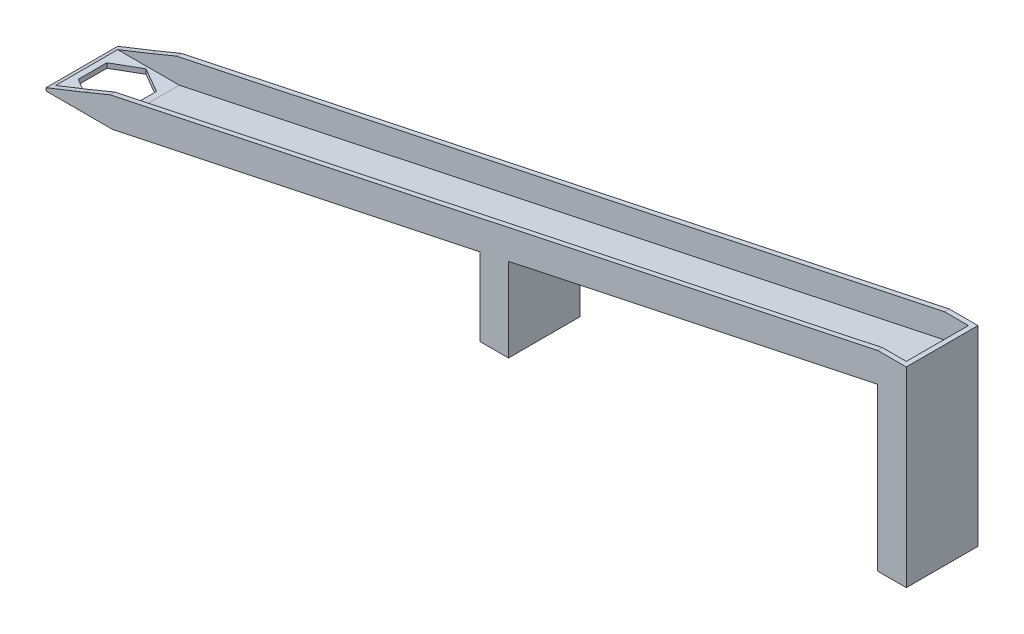
ISO-10303-21;
HEADER;
FILE_DESCRIPTION(('STEP AP214'),'2;1');
FILE_NAME('part.step','',(''),(''),'','','');
FILE_SCHEMA(('AUTOMOTIVE_DESIGN { 1 0 10303 214 1 1 1 1 }'));
ENDSEC;
DATA;
#1=APPLICATION_CONTEXT('core data for automotive mechanical design processes');
#2=APPLICATION_PROTOCOL_DEFINITION('international standard','automotive_design',2000,#1);
#3=PRODUCT_CONTEXT('',#1,'mechanical');
#4=PRODUCT('Part','Part','',(#3));
#5=PRODUCT_RELATED_PRODUCT_CATEGORY('part','',(#4));
#6=PRODUCT_DEFINITION_FORMATION('','',#4);
#7=PRODUCT_DEFINITION_CONTEXT('part definition',#1,'design');
#8=PRODUCT_DEFINITION('design','',#6,#7);
#9=PRODUCT_DEFINITION_SHAPE('','',#8);
#10=(LENGTH_UNIT() NAMED_UNIT(*) SI_UNIT(.MILLI.,.METRE.));
#11=(NAMED_UNIT(*) PLANE_ANGLE_UNIT() SI_UNIT($,.RADIAN.));
#12=(NAMED_UNIT(*) SI_UNIT($,.STERADIAN.) SOLID_ANGLE_UNIT());
#13=UNCERTAINTY_MEASURE_WITH_UNIT(LENGTH_MEASURE(1.E-05),#10,'distance_accuracy_value','');
#14=(GEOMETRIC_REPRESENTATION_CONTEXT(3) GLOBAL_UNCERTAINTY_ASSIGNED_CONTEXT((#13)) GLOBAL_UNIT_ASSIGNED_CONTEXT((#10,
#11,#12)) REPRESENTATION_CONTEXT('',''));
#15=CARTESIAN_POINT('',(0.,0.,0.));
#16=DIRECTION('',(0.,0.,1.));
#17=DIRECTION('',(1.,0.,0.));
#18=AXIS2_PLACEMENT_3D('',#15,#16,#17);
#19=CARTESIAN_POINT('',(70.,0.,75.));
#20=DIRECTION('',(-0.207080952730413,0.978323810921652,0.));
#21=DIRECTION('',(-0.978323810921652,-0.207080952730413,0.));
#22=AXIS2_PLACEMENT_3D('',#19,#20,#21);
#23=PLANE('',#22);
#24=DIRECTION('',(0.978323810921652,0.207080952730413,0.));
#25=VECTOR('',#24,1.);
#26=CARTESIAN_POINT('',(70.,0.,75.));
#27=LINE('',#26,#25);
#28=CARTESIAN_POINT('',(483.833635791434,87.5958068431843,75.));
#29=VERTEX_POINT('',#28);
#30=CARTESIAN_POINT('',(870.,169.335306301359,75.));
#31=VERTEX_POINT('',#30);
#32=EDGE_CURVE('E52',#29,#31,#27,.T.);
#33=ORIENTED_EDGE('',*,*,#32,.F.);
#34=DIRECTION('',(0.,0.,1.));
#35=VECTOR('',#34,1.);
#36=CARTESIAN_POINT('',(483.833635791434,87.5958068431843,0.));
#37=LINE('',#36,#35);
#38=CARTESIAN_POINT('',(483.833635791434,87.5958068431843,0.));
#39=VERTEX_POINT('',#38);
#40=EDGE_CURVE('E255',#39,#29,#37,.T.);
#41=ORIENTED_EDGE('',*,*,#40,.F.);
#42=DIRECTION('',(0.978323810921652,0.207080952730413,0.));
#43=VECTOR('',#42,1.);
#44=CARTESIAN_POINT('',(70.,0.,0.));
#45=LINE('',#44,#43);
#46=CARTESIAN_POINT('',(870.,169.335306301359,0.));
#47=VERTEX_POINT('',#46);
#48=EDGE_CURVE('E387',#39,#47,#45,.T.);
#49=ORIENTED_EDGE('',*,*,#48,.T.);
#50=DIRECTION('',(0.,0.,-1.));
#51=VECTOR('',#50,1.);
#52=CARTESIAN_POINT('',(870.,169.335306301359,75.));
#53=LINE('',#52,#51);
#54=EDGE_CURVE('E406',#31,#47,#53,.T.);
#55=ORIENTED_EDGE('',*,*,#54,.F.);
#56=EDGE_LOOP('',(#33,#41,#49,#55));
#57=FACE_BOUND('',#56,.T.);
#58=ADVANCED_FACE('F37',(#57),#23,.F.);
#59=CARTESIAN_POINT('',(900.,200.,75.));
#60=DIRECTION('',(0.,-1.,0.));
#61=DIRECTION('',(1.,0.,0.));
#62=AXIS2_PLACEMENT_3D('',#59,#60,#61);
#63=PLANE('',#62);
#64=DIRECTION('',(-1.,0.,0.));
#65=VECTOR('',#64,1.);
#66=CARTESIAN_POINT('',(900.,200.,5.));
#67=LINE('',#66,#65);
#68=CARTESIAN_POINT('',(895.,200.,5.));
#69=VERTEX_POINT('',#68);
#70=CARTESIAN_POINT('',(870.,200.,5.));
#71=VERTEX_POINT('',#70);
#72=EDGE_CURVE('E356',#69,#71,#67,.T.);
#73=ORIENTED_EDGE('',*,*,#72,.F.);
#74=DIRECTION('',(0.,0.,-1.));
#75=VECTOR('',#74,1.);
#76=CARTESIAN_POINT('',(895.,200.,75.));
#77=LINE('',#76,#75);
#78=CARTESIAN_POINT('',(895.,200.,70.));
#79=VERTEX_POINT('',#78);
#80=EDGE_CURVE('E352',#79,#69,#77,.T.);
#81=ORIENTED_EDGE('',*,*,#80,.F.);
#82=DIRECTION('',(-1.,0.,0.));
#83=VECTOR('',#82,1.);
#84=CARTESIAN_POINT('',(900.,200.,70.));
#85=LINE('',#84,#83);
#86=CARTESIAN_POINT('',(870.,200.,70.));
#87=VERTEX_POINT('',#86);
#88=EDGE_CURVE('E358',#79,#87,#85,.T.);
#89=ORIENTED_EDGE('',*,*,#88,.T.);
#90=DIRECTION('',(0.,0.,-1.));
#91=VECTOR('',#90,1.);
#92=CARTESIAN_POINT('',(870.,200.,75.));
#93=LINE('',#92,#91);
#94=CARTESIAN_POINT('',(870.,200.,75.));
#95=VERTEX_POINT('',#94);
#96=EDGE_CURVE('E400',#95,#87,#93,.T.);
#97=ORIENTED_EDGE('',*,*,#96,.F.);
#98=DIRECTION('',(-1.,0.,0.));
#99=VECTOR('',#98,1.);
#100=CARTESIAN_POINT('',(900.,200.,75.));
#101=LINE('',#100,#99);
#102=CARTESIAN_POINT('',(900.,200.,75.));
#103=VERTEX_POINT('',#102);
#104=EDGE_CURVE('E378',#103,#95,#101,.T.);
#105=ORIENTED_EDGE('',*,*,#104,.F.);
#106=DIRECTION('',(0.,0.,-1.));
#107=VECTOR('',#106,1.);
#108=CARTESIAN_POINT('',(900.,200.,75.));
#109=LINE('',#108,#107);
#110=CARTESIAN_POINT('',(900.,200.,0.));
#111=VERTEX_POINT('',#110);
#112=EDGE_CURVE('E403',#103,#111,#109,.T.);
#113=ORIENTED_EDGE('',*,*,#112,.T.);
#114=DIRECTION('',(-1.,0.,0.));
#115=VECTOR('',#114,1.);
#116=CARTESIAN_POINT('',(900.,200.,0.));
#117=LINE('',#116,#115);
#118=CARTESIAN_POINT('',(870.,200.,0.));
#119=VERTEX_POINT('',#118);
#120=EDGE_CURVE('E392',#111,#119,#117,.T.);
#121=ORIENTED_EDGE('',*,*,#120,.T.);
#122=EDGE_CURVE('E399',#71,#119,#93,.T.);
#123=ORIENTED_EDGE('',*,*,#122,.F.);
#124=EDGE_LOOP('',(#73,#81,#89,#97,#105,#113,#121,#123));
#125=FACE_BOUND('',#124,.T.);
#126=ADVANCED_FACE('F485',(#125),#63,.F.);
#127=CARTESIAN_POINT('',(870.,200.,75.));
#128=DIRECTION('',(0.207080952730413,-0.978323810921652,0.));
#129=DIRECTION('',(0.978323810921652,0.207080952730413,0.));
#130=AXIS2_PLACEMENT_3D('',#127,#128,#129);
#131=PLANE('',#130);
#132=DIRECTION('',(-0.978323810921652,-0.207080952730413,0.));
#133=VECTOR('',#132,1.);
#134=CARTESIAN_POINT('',(870.,200.,5.));
#135=LINE('',#134,#133);
#136=CARTESIAN_POINT('',(66.8597513978174,30.,5.));
#137=VERTEX_POINT('',#136);
#138=EDGE_CURVE('E340',#71,#137,#135,.T.);
#139=ORIENTED_EDGE('',*,*,#138,.F.);
#140=ORIENTED_EDGE('',*,*,#122,.T.);
#141=DIRECTION('',(-0.978323810921652,-0.207080952730413,0.));
#142=VECTOR('',#141,1.);
#143=CARTESIAN_POINT('',(870.,200.,0.));
#144=LINE('',#143,#142);
#145=CARTESIAN_POINT('',(66.8597513978174,30.,0.));
#146=VERTEX_POINT('',#145);
#147=EDGE_CURVE('E372',#119,#146,#144,.T.);
#148=ORIENTED_EDGE('',*,*,#147,.T.);
#149=DIRECTION('',(0.,0.,-1.));
#150=VECTOR('',#149,1.);
#151=CARTESIAN_POINT('',(66.8597513978174,30.,75.));
#152=LINE('',#151,#150);
#153=EDGE_CURVE('E383',#137,#146,#152,.T.);
#154=ORIENTED_EDGE('',*,*,#153,.F.);
#155=EDGE_LOOP('',(#139,#140,#148,#154));
#156=FACE_BOUND('',#155,.T.);
#157=ADVANCED_FACE('F449',(#156),#131,.F.);
#158=CARTESIAN_POINT('',(0.,30.,75.));
#159=DIRECTION('',(1.,0.,0.));
#160=DIRECTION('',(0.,1.,0.));
#161=AXIS2_PLACEMENT_3D('',#158,#159,#160);
#162=PLANE('',#161);
#163=DIRECTION('',(0.,-1.,0.));
#164=VECTOR('',#163,1.);
#165=CARTESIAN_POINT('',(0.,30.,75.));
#166=LINE('',#165,#164);
#167=CARTESIAN_POINT('',(0.,2.99999999999999,75.));
#168=VERTEX_POINT('',#167);
#169=CARTESIAN_POINT('',(0.,0.,75.));
#170=VERTEX_POINT('',#169);
#171=EDGE_CURVE('E369',#168,#170,#166,.T.);
#172=ORIENTED_EDGE('',*,*,#171,.F.);
#173=DIRECTION('',(0.,0.,1.));
#174=VECTOR('',#173,1.);
#175=CARTESIAN_POINT('',(0.,2.99999999999999,-15.));
#176=LINE('',#175,#174);
#177=CARTESIAN_POINT('',(0.,2.99999999999999,0.));
#178=VERTEX_POINT('',#177);
#179=EDGE_CURVE('E281',#178,#168,#176,.T.);
#180=ORIENTED_EDGE('',*,*,#179,.F.);
#181=DIRECTION('',(0.,-1.,0.));
#182=VECTOR('',#181,1.);
#183=CARTESIAN_POINT('',(0.,30.,0.));
#184=LINE('',#183,#182);
#185=CARTESIAN_POINT('',(0.,0.,0.));
#186=VERTEX_POINT('',#185);
#187=EDGE_CURVE('E335',#178,#186,#184,.T.);
#188=ORIENTED_EDGE('',*,*,#187,.T.);
#189=DIRECTION('',(0.,0.,-1.));
#190=VECTOR('',#189,1.);
#191=CARTESIAN_POINT('',(0.,0.,75.));
#192=LINE('',#191,#190);
#193=EDGE_CURVE('E412',#170,#186,#192,.T.);
#194=ORIENTED_EDGE('',*,*,#193,.F.);
#195=EDGE_LOOP('',(#172,#180,#188,#194));
#196=FACE_BOUND('',#195,.T.);
#197=ADVANCED_FACE('F39',(#196),#162,.F.);
#198=CARTESIAN_POINT('',(0.,0.,75.));
#199=DIRECTION('',(0.,1.,0.));
#200=DIRECTION('',(0.,0.,1.));
#201=AXIS2_PLACEMENT_3D('',#198,#199,#200);
#202=PLANE('',#201);
#203=DIRECTION('',(0.,0.,-1.));
#204=VECTOR('',#203,1.);
#205=CARTESIAN_POINT('',(63.1909474220098,0.,75.));
#206=LINE('',#205,#204);
#207=CARTESIAN_POINT('',(63.1909474220098,0.,52.5818310934814));
#208=VERTEX_POINT('',#207);
#209=CARTESIAN_POINT('',(63.1909474220098,0.,22.5818310934814));
#210=VERTEX_POINT('',#209);
#211=EDGE_CURVE('E427',#208,#210,#206,.T.);
#212=ORIENTED_EDGE('',*,*,#211,.T.);
#213=DIRECTION('',(-0.866025403784439,0.,-0.5));
#214=VECTOR('',#213,1.);
#215=CARTESIAN_POINT('',(38.4954698019568,0.,8.32389044177741));
#216=LINE('',#215,#214);
#217=CARTESIAN_POINT('',(37.2101853084766,0.,7.58183109348139));
#218=VERTEX_POINT('',#217);
#219=EDGE_CURVE('E430',#210,#218,#216,.T.);
#220=ORIENTED_EDGE('',*,*,#219,.T.);
#221=DIRECTION('',(-0.866025403784439,0.,0.5));
#222=VECTOR('',#221,1.);
#223=CARTESIAN_POINT('',(-19.8903771477185,0.,40.5488561984447));
#224=LINE('',#223,#222);
#225=CARTESIAN_POINT('',(11.2294231949435,0.,22.5818310934814));
#226=VERTEX_POINT('',#225);
#227=EDGE_CURVE('E415',#218,#226,#224,.T.);
#228=ORIENTED_EDGE('',*,*,#227,.T.);
#229=DIRECTION('',(0.,0.,1.));
#230=VECTOR('',#229,1.);
#231=CARTESIAN_POINT('',(11.2294231949435,0.,75.));
#232=LINE('',#231,#230);
#233=CARTESIAN_POINT('',(11.2294231949435,0.,52.5818310934814));
#234=VERTEX_POINT('',#233);
#235=EDGE_CURVE('E418',#226,#234,#232,.T.);
#236=ORIENTED_EDGE('',*,*,#235,.T.);
#237=DIRECTION('',(0.866025403784439,0.,0.5));
#238=VECTOR('',#237,1.);
#239=CARTESIAN_POINT('',(12.5147076884236,0.,53.3238904417774));
#240=LINE('',#239,#238);
#241=CARTESIAN_POINT('',(37.2101853084766,0.,67.5818310934814));
#242=VERTEX_POINT('',#241);
#243=EDGE_CURVE('E421',#234,#242,#240,.T.);
#244=ORIENTED_EDGE('',*,*,#243,.T.);
#245=DIRECTION('',(0.86602540378444,0.,-0.499999999999998));
#246=VECTOR('',#245,1.);
#247=CARTESIAN_POINT('',(6.09038496581462,0.,85.5488561984446));
#248=LINE('',#247,#246);
#249=EDGE_CURVE('E424',#242,#208,#248,.T.);
#250=ORIENTED_EDGE('',*,*,#249,.T.);
#251=EDGE_LOOP('',(#212,#220,#228,#236,#244,#250));
#252=FACE_BOUND('',#251,.T.);
#253=DIRECTION('',(1.,0.,0.));
#254=VECTOR('',#253,1.);
#255=CARTESIAN_POINT('',(0.,0.,0.));
#256=LINE('',#255,#254);
#257=CARTESIAN_POINT('',(70.,0.,0.));
#258=VERTEX_POINT('',#257);
#259=EDGE_CURVE('E385',#186,#258,#256,.T.);
#260=ORIENTED_EDGE('',*,*,#259,.T.);
#261=DIRECTION('',(0.,0.,-1.));
#262=VECTOR('',#261,1.);
#263=CARTESIAN_POINT('',(70.,0.,75.));
#264=LINE('',#263,#262);
#265=CARTESIAN_POINT('',(70.,0.,75.));
#266=VERTEX_POINT('',#265);
#267=EDGE_CURVE('E409',#266,#258,#264,.T.);
#268=ORIENTED_EDGE('',*,*,#267,.F.);
#269=DIRECTION('',(1.,0.,0.));
#270=VECTOR('',#269,1.);
#271=CARTESIAN_POINT('',(0.,0.,75.));
#272=LINE('',#271,#270);
#273=EDGE_CURVE('E371',#170,#266,#272,.T.);
#274=ORIENTED_EDGE('',*,*,#273,.F.);
#275=ORIENTED_EDGE('',*,*,#193,.T.);
#276=EDGE_LOOP('',(#260,#268,#274,#275));
#277=FACE_BOUND('',#276,.T.);
#278=ADVANCED_FACE('F465',(#252,#277),#202,.F.);
#279=CARTESIAN_POINT('',(453.833635791434,81.2457328568834,0.));
#280=VERTEX_POINT('',#279);
#281=EDGE_CURVE('E388',#258,#280,#45,.T.);
#282=ORIENTED_EDGE('',*,*,#281,.T.);
#283=DIRECTION('',(0.,0.,1.));
#284=VECTOR('',#283,1.);
#285=CARTESIAN_POINT('',(453.833635791434,81.2457328568834,0.));
#286=LINE('',#285,#284);
#287=CARTESIAN_POINT('',(453.833635791434,81.2457328568834,75.));
#288=VERTEX_POINT('',#287);
#289=EDGE_CURVE('E60',#280,#288,#286,.T.);
#290=ORIENTED_EDGE('',*,*,#289,.T.);
#291=EDGE_CURVE('E374',#266,#288,#27,.T.);
#292=ORIENTED_EDGE('',*,*,#291,.F.);
#293=ORIENTED_EDGE('',*,*,#267,.T.);
#294=EDGE_LOOP('',(#282,#290,#292,#293));
#295=FACE_BOUND('',#294,.T.);
#296=ADVANCED_FACE('F466',(#295),#23,.F.);
#297=CARTESIAN_POINT('',(900.,169.335306301359,75.));
#298=DIRECTION('',(-1.,0.,0.));
#299=DIRECTION('',(0.,0.,1.));
#300=AXIS2_PLACEMENT_3D('',#297,#298,#299);
#301=PLANE('',#300);
#302=DIRECTION('',(0.,1.,0.));
#303=VECTOR('',#302,1.);
#304=CARTESIAN_POINT('',(900.,169.335306301359,0.));
#305=LINE('',#304,#303);
#306=CARTESIAN_POINT('',(900.,0.,0.));
#307=VERTEX_POINT('',#306);
#308=EDGE_CURVE('E390',#307,#111,#305,.T.);
#309=ORIENTED_EDGE('',*,*,#308,.T.);
#310=ORIENTED_EDGE('',*,*,#112,.F.);
#311=DIRECTION('',(0.,1.,0.));
#312=VECTOR('',#311,1.);
#313=CARTESIAN_POINT('',(900.,169.335306301359,75.));
#314=LINE('',#313,#312);
#315=CARTESIAN_POINT('',(900.,0.,75.));
#316=VERTEX_POINT('',#315);
#317=EDGE_CURVE('E376',#316,#103,#314,.T.);
#318=ORIENTED_EDGE('',*,*,#317,.F.);
#319=DIRECTION('',(0.,0.,1.));
#320=VECTOR('',#319,1.);
#321=CARTESIAN_POINT('',(900.,0.,0.));
#322=LINE('',#321,#320);
#323=EDGE_CURVE('E272',#307,#316,#322,.T.);
#324=ORIENTED_EDGE('',*,*,#323,.F.);
#325=EDGE_LOOP('',(#309,#310,#318,#324));
#326=FACE_BOUND('',#325,.T.);
#327=ADVANCED_FACE('F483',(#326),#301,.F.);
#328=ORIENTED_EDGE('',*,*,#96,.T.);
#329=DIRECTION('',(-0.978323810921652,-0.207080952730413,0.));
#330=VECTOR('',#329,1.);
#331=CARTESIAN_POINT('',(870.,200.,70.));
#332=LINE('',#331,#330);
#333=CARTESIAN_POINT('',(66.8597513978174,30.,70.));
#334=VERTEX_POINT('',#333);
#335=EDGE_CURVE('E359',#87,#334,#332,.T.);
#336=ORIENTED_EDGE('',*,*,#335,.T.);
#337=CARTESIAN_POINT('',(66.8597513978174,30.,75.));
#338=VERTEX_POINT('',#337);
#339=EDGE_CURVE('E397',#338,#334,#152,.T.);
#340=ORIENTED_EDGE('',*,*,#339,.F.);
#341=DIRECTION('',(-0.978323810921652,-0.207080952730413,0.));
#342=VECTOR('',#341,1.);
#343=CARTESIAN_POINT('',(870.,200.,75.));
#344=LINE('',#343,#342);
#345=EDGE_CURVE('E380',#95,#338,#344,.T.);
#346=ORIENTED_EDGE('',*,*,#345,.F.);
#347=EDGE_LOOP('',(#328,#336,#340,#346));
#348=FACE_BOUND('',#347,.T.);
#349=ADVANCED_FACE('F491',(#348),#131,.F.);
#350=CARTESIAN_POINT('',(0.,0.,75.));
#351=DIRECTION('',(0.,0.,1.));
#352=DIRECTION('',(1.,0.,0.));
#353=AXIS2_PLACEMENT_3D('',#350,#351,#352);
#354=PLANE('',#353);
#355=DIRECTION('',(0.924630859746041,0.380864507673396,0.));
#356=VECTOR('',#355,1.);
#357=CARTESIAN_POINT('',(66.8597513978174,30.,75.));
#358=LINE('',#357,#356);
#359=CARTESIAN_POINT('',(40.8957260771237,19.3051636588231,75.));
#360=VERTEX_POINT('',#359);
#361=EDGE_CURVE('E279',#360,#338,#358,.T.);
#362=ORIENTED_EDGE('',*,*,#361,.F.);
#363=DIRECTION('',(0.928892213031952,0.370350181002524,0.));
#364=VECTOR('',#363,1.);
#365=CARTESIAN_POINT('',(40.8957260771237,19.3051636588231,75.));
#366=LINE('',#365,#364);
#367=EDGE_CURVE('E275',#168,#360,#366,.T.);
#368=ORIENTED_EDGE('',*,*,#367,.F.);
#369=ORIENTED_EDGE('',*,*,#171,.T.);
#370=ORIENTED_EDGE('',*,*,#273,.T.);
#371=ORIENTED_EDGE('',*,*,#291,.T.);
#372=DIRECTION('',(0.,-1.,0.));
#373=VECTOR('',#372,1.);
#374=CARTESIAN_POINT('',(453.833635791434,81.2457328568834,75.));
#375=LINE('',#374,#373);
#376=CARTESIAN_POINT('',(453.833635791434,0.,75.));
#377=VERTEX_POINT('',#376);
#378=EDGE_CURVE('E252',#288,#377,#375,.T.);
#379=ORIENTED_EDGE('',*,*,#378,.T.);
#380=DIRECTION('',(1.,0.,0.));
#381=VECTOR('',#380,1.);
#382=CARTESIAN_POINT('',(453.833635791434,0.,75.));
#383=LINE('',#382,#381);
#384=CARTESIAN_POINT('',(483.833635791434,0.,75.));
#385=VERTEX_POINT('',#384);
#386=EDGE_CURVE('E229',#377,#385,#383,.T.);
#387=ORIENTED_EDGE('',*,*,#386,.T.);
#388=DIRECTION('',(0.,1.,0.));
#389=VECTOR('',#388,1.);
#390=CARTESIAN_POINT('',(483.833635791434,0.,75.));
#391=LINE('',#390,#389);
#392=EDGE_CURVE('E246',#385,#29,#391,.T.);
#393=ORIENTED_EDGE('',*,*,#392,.T.);
#394=ORIENTED_EDGE('',*,*,#32,.T.);
#395=DIRECTION('',(0.,-1.,0.));
#396=VECTOR('',#395,1.);
#397=CARTESIAN_POINT('',(870.,0.,75.));
#398=LINE('',#397,#396);
#399=CARTESIAN_POINT('',(870.,0.,75.));
#400=VERTEX_POINT('',#399);
#401=EDGE_CURVE('E257',#31,#400,#398,.T.);
#402=ORIENTED_EDGE('',*,*,#401,.T.);
#403=DIRECTION('',(1.,0.,0.));
#404=VECTOR('',#403,1.);
#405=CARTESIAN_POINT('',(900.,0.,75.));
#406=LINE('',#405,#404);
#407=EDGE_CURVE('E264',#400,#316,#406,.T.);
#408=ORIENTED_EDGE('',*,*,#407,.T.);
#409=ORIENTED_EDGE('',*,*,#317,.T.);
#410=ORIENTED_EDGE('',*,*,#104,.T.);
#411=ORIENTED_EDGE('',*,*,#345,.T.);
#412=EDGE_LOOP('',(#362,#368,#369,#370,#371,#379,#387,#393,#394,#402,#408,#409,#410,#411));
#413=FACE_BOUND('',#412,.T.);
#414=ADVANCED_FACE('F462',(#413),#354,.T.);
#415=CARTESIAN_POINT('',(0.,0.,0.));
#416=DIRECTION('',(0.,0.,1.));
#417=DIRECTION('',(1.,0.,0.));
#418=AXIS2_PLACEMENT_3D('',#415,#416,#417);
#419=PLANE('',#418);
#420=DIRECTION('',(0.928892213031952,0.370350181002524,0.));
#421=VECTOR('',#420,1.);
#422=CARTESIAN_POINT('',(-1.03204619768465,2.58852223029419,0.));
#423=LINE('',#422,#421);
#424=CARTESIAN_POINT('',(40.8957260771237,19.3051636588231,0.));
#425=VERTEX_POINT('',#424);
#426=EDGE_CURVE('E291',#178,#425,#423,.T.);
#427=ORIENTED_EDGE('',*,*,#426,.T.);
#428=DIRECTION('',(0.924630859746041,0.380864507673396,0.));
#429=VECTOR('',#428,1.);
#430=CARTESIAN_POINT('',(-0.866245660476933,2.10299845131516,0.));
#431=LINE('',#430,#429);
#432=EDGE_CURVE('E296',#425,#146,#431,.T.);
#433=ORIENTED_EDGE('',*,*,#432,.T.);
#434=ORIENTED_EDGE('',*,*,#147,.F.);
#435=ORIENTED_EDGE('',*,*,#120,.F.);
#436=ORIENTED_EDGE('',*,*,#308,.F.);
#437=DIRECTION('',(1.,0.,0.));
#438=VECTOR('',#437,1.);
#439=CARTESIAN_POINT('',(900.,0.,0.));
#440=LINE('',#439,#438);
#441=CARTESIAN_POINT('',(870.,0.,0.));
#442=VERTEX_POINT('',#441);
#443=EDGE_CURVE('E263',#442,#307,#440,.T.);
#444=ORIENTED_EDGE('',*,*,#443,.F.);
#445=DIRECTION('',(0.,-1.,0.));
#446=VECTOR('',#445,1.);
#447=CARTESIAN_POINT('',(870.,0.,0.));
#448=LINE('',#447,#446);
#449=EDGE_CURVE('E260',#47,#442,#448,.T.);
#450=ORIENTED_EDGE('',*,*,#449,.F.);
#451=ORIENTED_EDGE('',*,*,#48,.F.);
#452=DIRECTION('',(0.,1.,0.));
#453=VECTOR('',#452,1.);
#454=CARTESIAN_POINT('',(483.833635791434,0.,0.));
#455=LINE('',#454,#453);
#456=CARTESIAN_POINT('',(483.833635791434,0.,0.));
#457=VERTEX_POINT('',#456);
#458=EDGE_CURVE('E243',#457,#39,#455,.T.);
#459=ORIENTED_EDGE('',*,*,#458,.F.);
#460=DIRECTION('',(1.,0.,0.));
#461=VECTOR('',#460,1.);
#462=CARTESIAN_POINT('',(453.833635791434,0.,0.));
#463=LINE('',#462,#461);
#464=CARTESIAN_POINT('',(453.833635791434,0.,0.));
#465=VERTEX_POINT('',#464);
#466=EDGE_CURVE('E226',#465,#457,#463,.T.);
#467=ORIENTED_EDGE('',*,*,#466,.F.);
#468=DIRECTION('',(0.,-1.,0.));
#469=VECTOR('',#468,1.);
#470=CARTESIAN_POINT('',(453.833635791434,81.2457328568834,0.));
#471=LINE('',#470,#469);
#472=EDGE_CURVE('E241',#280,#465,#471,.T.);
#473=ORIENTED_EDGE('',*,*,#472,.F.);
#474=ORIENTED_EDGE('',*,*,#281,.F.);
#475=ORIENTED_EDGE('',*,*,#259,.F.);
#476=ORIENTED_EDGE('',*,*,#187,.F.);
#477=EDGE_LOOP('',(#427,#433,#434,#435,#436,#444,#450,#451,#459,#467,#473,#474,#475,#476));
#478=FACE_BOUND('',#477,.T.);
#479=ADVANCED_FACE('F239',(#478),#419,.F.);
#480=CARTESIAN_POINT('',(0.,5.,75.));
#481=DIRECTION('',(0.,1.,0.));
#482=DIRECTION('',(0.,0.,1.));
#483=AXIS2_PLACEMENT_3D('',#480,#481,#482);
#484=PLANE('',#483);
#485=DIRECTION('',(0.,0.,-1.));
#486=VECTOR('',#485,1.);
#487=CARTESIAN_POINT('',(5.0162913949035,5.,75.));
#488=LINE('',#487,#486);
#489=CARTESIAN_POINT('',(5.0162913949035,5.,70.));
#490=VERTEX_POINT('',#489);
#491=CARTESIAN_POINT('',(5.01629139490349,5.,5.));
#492=VERTEX_POINT('',#491);
#493=EDGE_CURVE('E286',#490,#492,#488,.T.);
#494=ORIENTED_EDGE('',*,*,#493,.F.);
#495=DIRECTION('',(1.,0.,0.));
#496=VECTOR('',#495,1.);
#497=CARTESIAN_POINT('',(0.,5.,70.));
#498=LINE('',#497,#496);
#499=CARTESIAN_POINT('',(69.4766252329695,5.,70.));
#500=VERTEX_POINT('',#499);
#501=EDGE_CURVE('E337',#490,#500,#498,.T.);
#502=ORIENTED_EDGE('',*,*,#501,.T.);
#503=DIRECTION('',(0.,0.,-1.));
#504=VECTOR('',#503,1.);
#505=CARTESIAN_POINT('',(69.4766252329695,5.,75.));
#506=LINE('',#505,#504);
#507=CARTESIAN_POINT('',(69.4766252329695,5.,5.));
#508=VERTEX_POINT('',#507);
#509=EDGE_CURVE('E332',#500,#508,#506,.T.);
#510=ORIENTED_EDGE('',*,*,#509,.T.);
#511=DIRECTION('',(1.,0.,0.));
#512=VECTOR('',#511,1.);
#513=CARTESIAN_POINT('',(0.,5.,5.));
#514=LINE('',#513,#512);
#515=EDGE_CURVE('E319',#492,#508,#514,.T.);
#516=ORIENTED_EDGE('',*,*,#515,.F.);
#517=EDGE_LOOP('',(#494,#502,#510,#516));
#518=FACE_BOUND('',#517,.T.);
#519=DIRECTION('',(-0.866025403784439,0.,-0.5));
#520=VECTOR('',#519,1.);
#521=CARTESIAN_POINT('',(63.1909474220098,5.,22.5818310934814));
#522=LINE('',#521,#520);
#523=CARTESIAN_POINT('',(63.1909474220098,5.,22.5818310934814));
#524=VERTEX_POINT('',#523);
#525=CARTESIAN_POINT('',(37.2101853084766,5.,7.58183109348139));
#526=VERTEX_POINT('',#525);
#527=EDGE_CURVE('E299',#524,#526,#522,.T.);
#528=ORIENTED_EDGE('',*,*,#527,.F.);
#529=DIRECTION('',(0.,0.,-1.));
#530=VECTOR('',#529,1.);
#531=CARTESIAN_POINT('',(63.1909474220098,5.,52.5818310934814));
#532=LINE('',#531,#530);
#533=CARTESIAN_POINT('',(63.1909474220098,5.,52.5818310934814));
#534=VERTEX_POINT('',#533);
#535=EDGE_CURVE('E313',#534,#524,#532,.T.);
#536=ORIENTED_EDGE('',*,*,#535,.F.);
#537=DIRECTION('',(0.86602540378444,0.,-0.499999999999998));
#538=VECTOR('',#537,1.);
#539=CARTESIAN_POINT('',(37.2101853084766,5.,67.5818310934814));
#540=LINE('',#539,#538);
#541=CARTESIAN_POINT('',(37.2101853084766,5.,67.5818310934814));
#542=VERTEX_POINT('',#541);
#543=EDGE_CURVE('E311',#542,#534,#540,.T.);
#544=ORIENTED_EDGE('',*,*,#543,.F.);
#545=DIRECTION('',(0.866025403784439,0.,0.5));
#546=VECTOR('',#545,1.);
#547=CARTESIAN_POINT('',(11.2294231949435,5.,52.5818310934814));
#548=LINE('',#547,#546);
#549=CARTESIAN_POINT('',(11.2294231949435,5.,52.5818310934814));
#550=VERTEX_POINT('',#549);
#551=EDGE_CURVE('E308',#550,#542,#548,.T.);
#552=ORIENTED_EDGE('',*,*,#551,.F.);
#553=DIRECTION('',(0.,0.,1.));
#554=VECTOR('',#553,1.);
#555=CARTESIAN_POINT('',(11.2294231949435,5.,22.5818310934814));
#556=LINE('',#555,#554);
#557=CARTESIAN_POINT('',(11.2294231949435,5.,22.5818310934814));
#558=VERTEX_POINT('',#557);
#559=EDGE_CURVE('E305',#558,#550,#556,.T.);
#560=ORIENTED_EDGE('',*,*,#559,.F.);
#561=DIRECTION('',(-0.866025403784439,0.,0.5));
#562=VECTOR('',#561,1.);
#563=CARTESIAN_POINT('',(37.2101853084766,5.,7.58183109348139));
#564=LINE('',#563,#562);
#565=EDGE_CURVE('E302',#526,#558,#564,.T.);
#566=ORIENTED_EDGE('',*,*,#565,.F.);
#567=EDGE_LOOP('',(#528,#536,#544,#552,#560,#566));
#568=FACE_BOUND('',#567,.T.);
#569=ADVANCED_FACE('F502',(#518,#568),#484,.T.);
#570=CARTESIAN_POINT('',(68.9645952363479,4.89161905460826,75.));
#571=DIRECTION('',(-0.207080952730413,0.978323810921652,0.));
#572=DIRECTION('',(-0.978323810921652,-0.207080952730413,0.));
#573=AXIS2_PLACEMENT_3D('',#570,#571,#572);
#574=PLANE('',#573);
#575=DIRECTION('',(0.978323810921652,0.207080952730413,0.));
#576=VECTOR('',#575,1.);
#577=CARTESIAN_POINT('',(68.9645952363479,4.89161905460826,5.));
#578=LINE('',#577,#576);
#579=CARTESIAN_POINT('',(869.47662523297,174.335306301359,5.));
#580=VERTEX_POINT('',#579);
#581=EDGE_CURVE('E331',#508,#580,#578,.T.);
#582=ORIENTED_EDGE('',*,*,#581,.F.);
#583=ORIENTED_EDGE('',*,*,#509,.F.);
#584=DIRECTION('',(0.978323810921652,0.207080952730413,0.));
#585=VECTOR('',#584,1.);
#586=CARTESIAN_POINT('',(68.9645952363479,4.89161905460826,70.));
#587=LINE('',#586,#585);
#588=CARTESIAN_POINT('',(869.47662523297,174.335306301359,70.));
#589=VERTEX_POINT('',#588);
#590=EDGE_CURVE('E339',#500,#589,#587,.T.);
#591=ORIENTED_EDGE('',*,*,#590,.T.);
#592=DIRECTION('',(0.,0.,-1.));
#593=VECTOR('',#592,1.);
#594=CARTESIAN_POINT('',(869.47662523297,174.335306301359,75.));
#595=LINE('',#594,#593);
#596=EDGE_CURVE('E336',#589,#580,#595,.T.);
#597=ORIENTED_EDGE('',*,*,#596,.T.);
#598=EDGE_LOOP('',(#582,#583,#591,#597));
#599=FACE_BOUND('',#598,.T.);
#600=ADVANCED_FACE('F506',(#599),#574,.T.);
#601=CARTESIAN_POINT('',(870.,174.335306301359,75.));
#602=DIRECTION('',(0.,1.,0.));
#603=DIRECTION('',(0.,0.,1.));
#604=AXIS2_PLACEMENT_3D('',#601,#602,#603);
#605=PLANE('',#604);
#606=DIRECTION('',(1.,0.,0.));
#607=VECTOR('',#606,1.);
#608=CARTESIAN_POINT('',(870.,174.335306301359,5.));
#609=LINE('',#608,#607);
#610=CARTESIAN_POINT('',(895.,174.335306301359,5.));
#611=VERTEX_POINT('',#610);
#612=EDGE_CURVE('E342',#580,#611,#609,.T.);
#613=ORIENTED_EDGE('',*,*,#612,.F.);
#614=ORIENTED_EDGE('',*,*,#596,.F.);
#615=DIRECTION('',(1.,0.,0.));
#616=VECTOR('',#615,1.);
#617=CARTESIAN_POINT('',(870.,174.335306301359,70.));
#618=LINE('',#617,#616);
#619=CARTESIAN_POINT('',(895.,174.335306301359,70.));
#620=VERTEX_POINT('',#619);
#621=EDGE_CURVE('E347',#589,#620,#618,.T.);
#622=ORIENTED_EDGE('',*,*,#621,.T.);
#623=DIRECTION('',(0.,0.,-1.));
#624=VECTOR('',#623,1.);
#625=CARTESIAN_POINT('',(895.,174.335306301359,75.));
#626=LINE('',#625,#624);
#627=EDGE_CURVE('E345',#620,#611,#626,.T.);
#628=ORIENTED_EDGE('',*,*,#627,.T.);
#629=EDGE_LOOP('',(#613,#614,#622,#628));
#630=FACE_BOUND('',#629,.T.);
#631=ADVANCED_FACE('F512',(#630),#605,.T.);
#632=CARTESIAN_POINT('',(895.,169.335306301359,75.));
#633=DIRECTION('',(-1.,0.,0.));
#634=DIRECTION('',(0.,0.,1.));
#635=AXIS2_PLACEMENT_3D('',#632,#633,#634);
#636=PLANE('',#635);
#637=DIRECTION('',(0.,1.,0.));
#638=VECTOR('',#637,1.);
#639=CARTESIAN_POINT('',(895.,169.335306301359,5.));
#640=LINE('',#639,#638);
#641=EDGE_CURVE('E349',#611,#69,#640,.T.);
#642=ORIENTED_EDGE('',*,*,#641,.F.);
#643=ORIENTED_EDGE('',*,*,#627,.F.);
#644=DIRECTION('',(0.,1.,0.));
#645=VECTOR('',#644,1.);
#646=CARTESIAN_POINT('',(895.,169.335306301359,70.));
#647=LINE('',#646,#645);
#648=EDGE_CURVE('E354',#620,#79,#647,.T.);
#649=ORIENTED_EDGE('',*,*,#648,.T.);
#650=ORIENTED_EDGE('',*,*,#80,.T.);
#651=EDGE_LOOP('',(#642,#643,#649,#650));
#652=FACE_BOUND('',#651,.T.);
#653=ADVANCED_FACE('F515',(#652),#636,.T.);
#654=CARTESIAN_POINT('',(0.,0.,70.));
#655=DIRECTION('',(0.,0.,1.));
#656=DIRECTION('',(1.,0.,0.));
#657=AXIS2_PLACEMENT_3D('',#654,#655,#656);
#658=PLANE('',#657);
#659=DIRECTION('',(0.928892213031952,0.370350181002524,0.));
#660=VECTOR('',#659,1.);
#661=CARTESIAN_POINT('',(-1.03204619768465,2.58852223029419,70.));
#662=LINE('',#661,#660);
#663=CARTESIAN_POINT('',(40.8957260771237,19.3051636588231,70.));
#664=VERTEX_POINT('',#663);
#665=EDGE_CURVE('E288',#490,#664,#662,.T.);
#666=ORIENTED_EDGE('',*,*,#665,.T.);
#667=DIRECTION('',(0.924630859746041,0.380864507673396,0.));
#668=VECTOR('',#667,1.);
#669=CARTESIAN_POINT('',(-0.866245660476933,2.10299845131516,70.));
#670=LINE('',#669,#668);
#671=EDGE_CURVE('E293',#664,#334,#670,.T.);
#672=ORIENTED_EDGE('',*,*,#671,.T.);
#673=ORIENTED_EDGE('',*,*,#335,.F.);
#674=ORIENTED_EDGE('',*,*,#88,.F.);
#675=ORIENTED_EDGE('',*,*,#648,.F.);
#676=ORIENTED_EDGE('',*,*,#621,.F.);
#677=ORIENTED_EDGE('',*,*,#590,.F.);
#678=ORIENTED_EDGE('',*,*,#501,.F.);
#679=EDGE_LOOP('',(#666,#672,#673,#674,#675,#676,#677,#678));
#680=FACE_BOUND('',#679,.T.);
#681=ADVANCED_FACE('F497',(#680),#658,.F.);
#682=CARTESIAN_POINT('',(0.,0.,5.));
#683=DIRECTION('',(0.,0.,1.));
#684=DIRECTION('',(1.,0.,0.));
#685=AXIS2_PLACEMENT_3D('',#682,#683,#684);
#686=PLANE('',#685);
#687=DIRECTION('',(0.924630859746041,0.380864507673396,0.));
#688=VECTOR('',#687,1.);
#689=CARTESIAN_POINT('',(-0.866245660476933,2.10299845131516,5.));
#690=LINE('',#689,#688);
#691=CARTESIAN_POINT('',(40.8957260771237,19.3051636588231,5.));
#692=VERTEX_POINT('',#691);
#693=EDGE_CURVE('E11',#692,#137,#690,.T.);
#694=ORIENTED_EDGE('',*,*,#693,.F.);
#695=DIRECTION('',(0.928892213031952,0.370350181002524,0.));
#696=VECTOR('',#695,1.);
#697=CARTESIAN_POINT('',(-1.03204619768465,2.58852223029419,5.));
#698=LINE('',#697,#696);
#699=EDGE_CURVE('E45',#492,#692,#698,.T.);
#700=ORIENTED_EDGE('',*,*,#699,.F.);
#701=ORIENTED_EDGE('',*,*,#515,.T.);
#702=ORIENTED_EDGE('',*,*,#581,.T.);
#703=ORIENTED_EDGE('',*,*,#612,.T.);
#704=ORIENTED_EDGE('',*,*,#641,.T.);
#705=ORIENTED_EDGE('',*,*,#72,.T.);
#706=ORIENTED_EDGE('',*,*,#138,.T.);
#707=EDGE_LOOP('',(#694,#700,#701,#702,#703,#704,#705,#706));
#708=FACE_BOUND('',#707,.T.);
#709=ADVANCED_FACE('F443',(#708),#686,.T.);
#710=CARTESIAN_POINT('',(63.1909474220098,-55.,22.5818310934814));
#711=DIRECTION('',(0.5,0.,-0.866025403784439));
#712=DIRECTION('',(-0.866025403784439,0.,-0.5));
#713=AXIS2_PLACEMENT_3D('',#710,#711,#712);
#714=PLANE('',#713);
#715=DIRECTION('',(0.,1.,0.));
#716=VECTOR('',#715,1.);
#717=CARTESIAN_POINT('',(63.1909474220098,-55.,22.5818310934814));
#718=LINE('',#717,#716);
#719=EDGE_CURVE('E317',#210,#524,#718,.T.);
#720=ORIENTED_EDGE('',*,*,#719,.T.);
#721=ORIENTED_EDGE('',*,*,#527,.T.);
#722=DIRECTION('',(0.,1.,0.));
#723=VECTOR('',#722,1.);
#724=CARTESIAN_POINT('',(37.2101853084766,-55.,7.58183109348139));
#725=LINE('',#724,#723);
#726=EDGE_CURVE('E316',#218,#526,#725,.T.);
#727=ORIENTED_EDGE('',*,*,#726,.F.);
#728=ORIENTED_EDGE('',*,*,#219,.F.);
#729=EDGE_LOOP('',(#720,#721,#727,#728));
#730=FACE_BOUND('',#729,.T.);
#731=ADVANCED_FACE('F555',(#730),#714,.F.);
#732=CARTESIAN_POINT('',(63.1909474220098,-55.,52.5818310934814));
#733=DIRECTION('',(1.,0.,0.));
#734=DIRECTION('',(0.,0.,-1.));
#735=AXIS2_PLACEMENT_3D('',#732,#733,#734);
#736=PLANE('',#735);
#737=DIRECTION('',(0.,1.,0.));
#738=VECTOR('',#737,1.);
#739=CARTESIAN_POINT('',(63.1909474220098,-55.,52.5818310934814));
#740=LINE('',#739,#738);
#741=EDGE_CURVE('E320',#208,#534,#740,.T.);
#742=ORIENTED_EDGE('',*,*,#741,.T.);
#743=ORIENTED_EDGE('',*,*,#535,.T.);
#744=ORIENTED_EDGE('',*,*,#719,.F.);
#745=ORIENTED_EDGE('',*,*,#211,.F.);
#746=EDGE_LOOP('',(#742,#743,#744,#745));
#747=FACE_BOUND('',#746,.T.);
#748=ADVANCED_FACE('F543',(#747),#736,.F.);
#749=CARTESIAN_POINT('',(37.2101853084766,-55.,67.5818310934814));
#750=DIRECTION('',(0.499999999999998,0.,0.86602540378444));
#751=DIRECTION('',(0.86602540378444,0.,-0.499999999999998));
#752=AXIS2_PLACEMENT_3D('',#749,#750,#751);
#753=PLANE('',#752);
#754=DIRECTION('',(0.,1.,0.));
#755=VECTOR('',#754,1.);
#756=CARTESIAN_POINT('',(37.2101853084766,-55.,67.5818310934814));
#757=LINE('',#756,#755);
#758=EDGE_CURVE('E323',#242,#542,#757,.T.);
#759=ORIENTED_EDGE('',*,*,#758,.T.);
#760=ORIENTED_EDGE('',*,*,#543,.T.);
#761=ORIENTED_EDGE('',*,*,#741,.F.);
#762=ORIENTED_EDGE('',*,*,#249,.F.);
#763=EDGE_LOOP('',(#759,#760,#761,#762));
#764=FACE_BOUND('',#763,.T.);
#765=ADVANCED_FACE('F546',(#764),#753,.F.);
#766=CARTESIAN_POINT('',(11.2294231949435,-55.,52.5818310934814));
#767=DIRECTION('',(-0.5,0.,0.866025403784439));
#768=DIRECTION('',(0.866025403784439,0.,0.5));
#769=AXIS2_PLACEMENT_3D('',#766,#767,#768);
#770=PLANE('',#769);
#771=DIRECTION('',(0.,1.,0.));
#772=VECTOR('',#771,1.);
#773=CARTESIAN_POINT('',(11.2294231949435,-55.,52.5818310934814));
#774=LINE('',#773,#772);
#775=EDGE_CURVE('E325',#234,#550,#774,.T.);
#776=ORIENTED_EDGE('',*,*,#775,.T.);
#777=ORIENTED_EDGE('',*,*,#551,.T.);
#778=ORIENTED_EDGE('',*,*,#758,.F.);
#779=ORIENTED_EDGE('',*,*,#243,.F.);
#780=EDGE_LOOP('',(#776,#777,#778,#779));
#781=FACE_BOUND('',#780,.T.);
#782=ADVANCED_FACE('F563',(#781),#770,.F.);
#783=CARTESIAN_POINT('',(11.2294231949435,-55.,22.5818310934814));
#784=DIRECTION('',(-1.,0.,0.));
#785=DIRECTION('',(0.,0.,1.));
#786=AXIS2_PLACEMENT_3D('',#783,#784,#785);
#787=PLANE('',#786);
#788=DIRECTION('',(0.,1.,0.));
#789=VECTOR('',#788,1.);
#790=CARTESIAN_POINT('',(11.2294231949435,-55.,22.5818310934814));
#791=LINE('',#790,#789);
#792=EDGE_CURVE('E327',#226,#558,#791,.T.);
#793=ORIENTED_EDGE('',*,*,#792,.T.);
#794=ORIENTED_EDGE('',*,*,#559,.T.);
#795=ORIENTED_EDGE('',*,*,#775,.F.);
#796=ORIENTED_EDGE('',*,*,#235,.F.);
#797=EDGE_LOOP('',(#793,#794,#795,#796));
#798=FACE_BOUND('',#797,.T.);
#799=ADVANCED_FACE('F561',(#798),#787,.F.);
#800=CARTESIAN_POINT('',(37.2101853084766,-55.,7.58183109348139));
#801=DIRECTION('',(-0.5,0.,-0.866025403784439));
#802=DIRECTION('',(-0.866025403784439,0.,0.5));
#803=AXIS2_PLACEMENT_3D('',#800,#801,#802);
#804=PLANE('',#803);
#805=ORIENTED_EDGE('',*,*,#726,.T.);
#806=ORIENTED_EDGE('',*,*,#565,.T.);
#807=ORIENTED_EDGE('',*,*,#792,.F.);
#808=ORIENTED_EDGE('',*,*,#227,.F.);
#809=EDGE_LOOP('',(#805,#806,#807,#808));
#810=FACE_BOUND('',#809,.T.);
#811=ADVANCED_FACE('F557',(#810),#804,.F.);
#812=CARTESIAN_POINT('',(66.8597513978174,30.,-15.));
#813=DIRECTION('',(0.380864507673396,-0.924630859746041,0.));
#814=DIRECTION('',(0.924630859746041,0.380864507673396,0.));
#815=AXIS2_PLACEMENT_3D('',#812,#813,#814);
#816=PLANE('',#815);
#817=DIRECTION('',(0.,0.,1.));
#818=VECTOR('',#817,1.);
#819=CARTESIAN_POINT('',(40.8957260771237,19.3051636588231,-15.));
#820=LINE('',#819,#818);
#821=EDGE_CURVE('E284',#425,#692,#820,.T.);
#822=ORIENTED_EDGE('',*,*,#821,.T.);
#823=ORIENTED_EDGE('',*,*,#693,.T.);
#824=ORIENTED_EDGE('',*,*,#153,.T.);
#825=ORIENTED_EDGE('',*,*,#432,.F.);
#826=EDGE_LOOP('',(#822,#823,#824,#825));
#827=FACE_BOUND('',#826,.T.);
#828=ADVANCED_FACE('F442',(#827),#816,.F.);
#829=EDGE_CURVE('E282',#664,#360,#820,.T.);
#830=ORIENTED_EDGE('',*,*,#829,.T.);
#831=ORIENTED_EDGE('',*,*,#361,.T.);
#832=ORIENTED_EDGE('',*,*,#339,.T.);
#833=ORIENTED_EDGE('',*,*,#671,.F.);
#834=EDGE_LOOP('',(#830,#831,#832,#833));
#835=FACE_BOUND('',#834,.T.);
#836=ADVANCED_FACE('F493',(#835),#816,.F.);
#837=CARTESIAN_POINT('',(40.8957260771237,19.3051636588231,-15.));
#838=DIRECTION('',(0.370350181002524,-0.928892213031952,0.));
#839=DIRECTION('',(0.928892213031952,0.370350181002524,0.));
#840=AXIS2_PLACEMENT_3D('',#837,#838,#839);
#841=PLANE('',#840);
#842=ORIENTED_EDGE('',*,*,#179,.T.);
#843=ORIENTED_EDGE('',*,*,#367,.T.);
#844=ORIENTED_EDGE('',*,*,#829,.F.);
#845=ORIENTED_EDGE('',*,*,#665,.F.);
#846=ORIENTED_EDGE('',*,*,#493,.T.);
#847=ORIENTED_EDGE('',*,*,#699,.T.);
#848=ORIENTED_EDGE('',*,*,#821,.F.);
#849=ORIENTED_EDGE('',*,*,#426,.F.);
#850=EDGE_LOOP('',(#842,#843,#844,#845,#846,#847,#848,#849));
#851=FACE_BOUND('',#850,.T.);
#852=ADVANCED_FACE('F436',(#851),#841,.F.);
#853=CARTESIAN_POINT('',(900.,0.,0.));
#854=DIRECTION('',(0.,-1.,0.));
#855=DIRECTION('',(1.,0.,0.));
#856=AXIS2_PLACEMENT_3D('',#853,#854,#855);
#857=PLANE('',#856);
#858=ORIENTED_EDGE('',*,*,#407,.F.);
#859=DIRECTION('',(0.,0.,1.));
#860=VECTOR('',#859,1.);
#861=CARTESIAN_POINT('',(870.,0.,0.));
#862=LINE('',#861,#860);
#863=EDGE_CURVE('E267',#442,#400,#862,.T.);
#864=ORIENTED_EDGE('',*,*,#863,.F.);
#865=ORIENTED_EDGE('',*,*,#443,.T.);
#866=ORIENTED_EDGE('',*,*,#323,.T.);
#867=EDGE_LOOP('',(#858,#864,#865,#866));
#868=FACE_BOUND('',#867,.T.);
#869=ADVANCED_FACE('F478',(#868),#857,.T.);
#870=CARTESIAN_POINT('',(870.,0.,0.));
#871=DIRECTION('',(-1.,0.,0.));
#872=DIRECTION('',(0.,0.,1.));
#873=AXIS2_PLACEMENT_3D('',#870,#871,#872);
#874=PLANE('',#873);
#875=ORIENTED_EDGE('',*,*,#401,.F.);
#876=ORIENTED_EDGE('',*,*,#54,.T.);
#877=ORIENTED_EDGE('',*,*,#449,.T.);
#878=ORIENTED_EDGE('',*,*,#863,.T.);
#879=EDGE_LOOP('',(#875,#876,#877,#878));
#880=FACE_BOUND('',#879,.T.);
#881=ADVANCED_FACE('F473',(#880),#874,.T.);
#882=CARTESIAN_POINT('',(483.833635791434,0.,0.));
#883=DIRECTION('',(1.,0.,0.));
#884=DIRECTION('',(0.,0.,-1.));
#885=AXIS2_PLACEMENT_3D('',#882,#883,#884);
#886=PLANE('',#885);
#887=ORIENTED_EDGE('',*,*,#392,.F.);
#888=DIRECTION('',(0.,0.,1.));
#889=VECTOR('',#888,1.);
#890=CARTESIAN_POINT('',(483.833635791434,0.,0.));
#891=LINE('',#890,#889);
#892=EDGE_CURVE('E234',#457,#385,#891,.T.);
#893=ORIENTED_EDGE('',*,*,#892,.F.);
#894=ORIENTED_EDGE('',*,*,#458,.T.);
#895=ORIENTED_EDGE('',*,*,#40,.T.);
#896=EDGE_LOOP('',(#887,#893,#894,#895));
#897=FACE_BOUND('',#896,.T.);
#898=ADVANCED_FACE('F469',(#897),#886,.T.);
#899=CARTESIAN_POINT('',(453.833635791434,0.,0.));
#900=DIRECTION('',(0.,-1.,0.));
#901=DIRECTION('',(1.,0.,0.));
#902=AXIS2_PLACEMENT_3D('',#899,#900,#901);
#903=PLANE('',#902);
#904=ORIENTED_EDGE('',*,*,#386,.F.);
#905=DIRECTION('',(0.,0.,1.));
#906=VECTOR('',#905,1.);
#907=CARTESIAN_POINT('',(453.833635791434,0.,0.));
#908=LINE('',#907,#906);
#909=EDGE_CURVE('E223',#465,#377,#908,.T.);
#910=ORIENTED_EDGE('',*,*,#909,.F.);
#911=ORIENTED_EDGE('',*,*,#466,.T.);
#912=ORIENTED_EDGE('',*,*,#892,.T.);
#913=EDGE_LOOP('',(#904,#910,#911,#912));
#914=FACE_BOUND('',#913,.T.);
#915=ADVANCED_FACE('F225',(#914),#903,.T.);
#916=CARTESIAN_POINT('',(453.833635791434,81.2457328568834,0.));
#917=DIRECTION('',(-1.,0.,0.));
#918=DIRECTION('',(0.,0.,1.));
#919=AXIS2_PLACEMENT_3D('',#916,#917,#918);
#920=PLANE('',#919);
#921=ORIENTED_EDGE('',*,*,#378,.F.);
#922=ORIENTED_EDGE('',*,*,#289,.F.);
#923=ORIENTED_EDGE('',*,*,#472,.T.);
#924=ORIENTED_EDGE('',*,*,#909,.T.);
#925=EDGE_LOOP('',(#921,#922,#923,#924));
#926=FACE_BOUND('',#925,.T.);
#927=ADVANCED_FACE('F245',(#926),#920,.T.);
#928=CLOSED_SHELL('',(#58,#126,#157,#197,#278,#296,#327,#349,#414,#479,#569,#600,#631,#653,#681,
#709,#731,#748,#765,#782,#799,#811,#828,#836,#852,#869,#881,#898,#915,#927));
#929=MANIFOLD_SOLID_BREP('B2',#928);
#930=ADVANCED_BREP_SHAPE_REPRESENTATION('',(#18,#929),#14);
#931=SHAPE_DEFINITION_REPRESENTATION(#9,#930);
ENDSEC;
END-ISO-10303-21;
